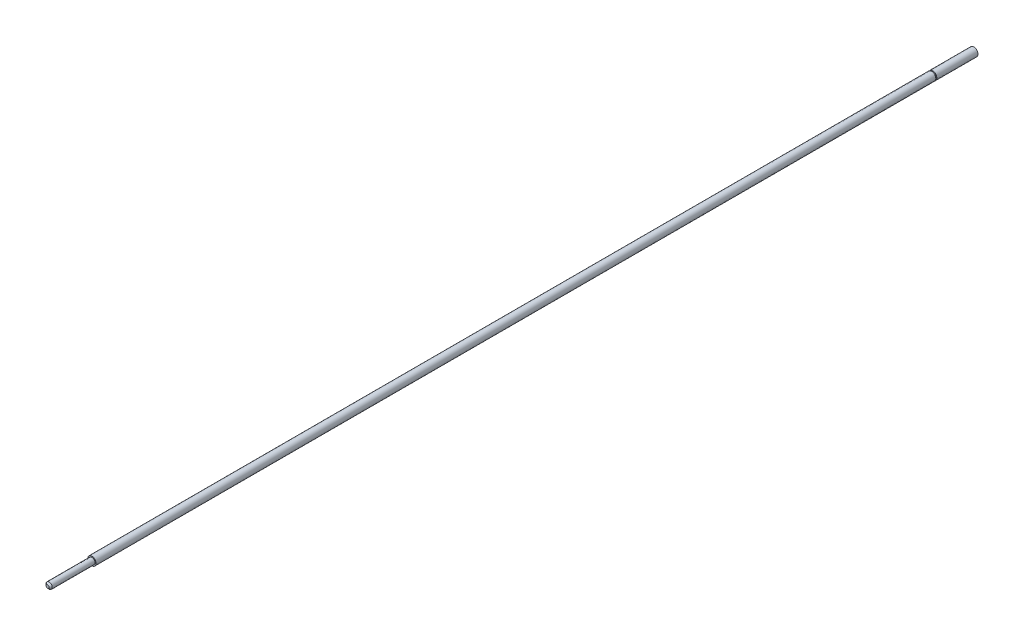
ISO-10303-21;
HEADER;
FILE_DESCRIPTION(('STEP AP214'),'2;1');
FILE_NAME('part.step','',(''),(''),'','','');
FILE_SCHEMA(('AUTOMOTIVE_DESIGN { 1 0 10303 214 1 1 1 1 }'));
ENDSEC;
DATA;
#1=APPLICATION_CONTEXT('core data for automotive mechanical design processes');
#2=APPLICATION_PROTOCOL_DEFINITION('international standard','automotive_design',2000,#1);
#3=PRODUCT_CONTEXT('',#1,'mechanical');
#4=PRODUCT('Part','Part','',(#3));
#5=PRODUCT_RELATED_PRODUCT_CATEGORY('part','',(#4));
#6=PRODUCT_DEFINITION_FORMATION('','',#4);
#7=PRODUCT_DEFINITION_CONTEXT('part definition',#1,'design');
#8=PRODUCT_DEFINITION('design','',#6,#7);
#9=PRODUCT_DEFINITION_SHAPE('','',#8);
#10=(LENGTH_UNIT() NAMED_UNIT(*) SI_UNIT(.MILLI.,.METRE.));
#11=(NAMED_UNIT(*) PLANE_ANGLE_UNIT() SI_UNIT($,.RADIAN.));
#12=(NAMED_UNIT(*) SI_UNIT($,.STERADIAN.) SOLID_ANGLE_UNIT());
#13=UNCERTAINTY_MEASURE_WITH_UNIT(LENGTH_MEASURE(1.E-05),#10,'distance_accuracy_value','');
#14=(GEOMETRIC_REPRESENTATION_CONTEXT(3) GLOBAL_UNCERTAINTY_ASSIGNED_CONTEXT((#13)) GLOBAL_UNIT_ASSIGNED_CONTEXT((#10,
#11,#12)) REPRESENTATION_CONTEXT('',''));
#15=CARTESIAN_POINT('',(0.,0.,0.));
#16=DIRECTION('',(0.,0.,1.));
#17=DIRECTION('',(1.,0.,0.));
#18=AXIS2_PLACEMENT_3D('',#15,#16,#17);
#19=CARTESIAN_POINT('',(0.,0.,846.));
#20=DIRECTION('',(0.,0.,1.));
#21=DIRECTION('',(1.,0.,0.));
#22=AXIS2_PLACEMENT_3D('',#19,#20,#21);
#23=PLANE('',#22);
#24=CARTESIAN_POINT('',(0.,0.,846.));
#25=DIRECTION('',(0.,0.,1.));
#26=DIRECTION('',(1.,0.,0.));
#27=AXIS2_PLACEMENT_3D('',#24,#25,#26);
#28=CIRCLE('',#27,4.);
#29=CARTESIAN_POINT('',(4.,0.,846.));
#30=VERTEX_POINT('',#29);
#31=EDGE_CURVE('E143',#30,#30,#28,.T.);
#32=ORIENTED_EDGE('',*,*,#31,.T.);
#33=EDGE_LOOP('',(#32));
#34=FACE_BOUND('',#33,.T.);
#35=CARTESIAN_POINT('',(0.,0.,846.));
#36=DIRECTION('',(0.,0.,1.));
#37=DIRECTION('',(1.,0.,0.));
#38=AXIS2_PLACEMENT_3D('',#35,#36,#37);
#39=CIRCLE('',#38,3.);
#40=CARTESIAN_POINT('',(3.,0.,846.));
#41=VERTEX_POINT('',#40);
#42=EDGE_CURVE('E134',#41,#41,#39,.T.);
#43=ORIENTED_EDGE('',*,*,#42,.F.);
#44=EDGE_LOOP('',(#43));
#45=FACE_BOUND('',#44,.T.);
#46=ADVANCED_FACE('F32',(#34,#45),#23,.T.);
#47=CARTESIAN_POINT('',(0.,0.,39.5));
#48=DIRECTION('',(0.,0.,1.));
#49=DIRECTION('',(1.,0.,0.));
#50=AXIS2_PLACEMENT_3D('',#47,#48,#49);
#51=PLANE('',#50);
#52=CARTESIAN_POINT('',(0.,0.,39.5));
#53=DIRECTION('',(0.,0.,1.));
#54=DIRECTION('',(1.,0.,0.));
#55=AXIS2_PLACEMENT_3D('',#52,#53,#54);
#56=CIRCLE('',#55,4.);
#57=CARTESIAN_POINT('',(4.,0.,39.5));
#58=VERTEX_POINT('',#57);
#59=EDGE_CURVE('E155',#58,#58,#56,.T.);
#60=ORIENTED_EDGE('',*,*,#59,.T.);
#61=EDGE_LOOP('',(#60));
#62=FACE_BOUND('',#61,.T.);
#63=CARTESIAN_POINT('',(0.,0.,39.5));
#64=DIRECTION('',(0.,0.,1.));
#65=DIRECTION('',(1.,0.,0.));
#66=AXIS2_PLACEMENT_3D('',#63,#64,#65);
#67=CIRCLE('',#66,3.);
#68=CARTESIAN_POINT('',(3.,0.,39.5));
#69=VERTEX_POINT('',#68);
#70=EDGE_CURVE('E146',#69,#69,#67,.T.);
#71=ORIENTED_EDGE('',*,*,#70,.F.);
#72=EDGE_LOOP('',(#71));
#73=FACE_BOUND('',#72,.T.);
#74=ADVANCED_FACE('F173',(#62,#73),#51,.T.);
#75=CARTESIAN_POINT('',(0.,0.,39.5));
#76=DIRECTION('',(0.,0.,-1.));
#77=DIRECTION('',(-1.,0.,0.));
#78=AXIS2_PLACEMENT_3D('',#75,#76,#77);
#79=CYLINDRICAL_SURFACE('',#78,4.);
#80=ORIENTED_EDGE('',*,*,#59,.F.);
#81=EDGE_LOOP('',(#80));
#82=FACE_BOUND('',#81,.T.);
#83=CARTESIAN_POINT('',(0.,0.,0.));
#84=DIRECTION('',(0.,0.,1.));
#85=DIRECTION('',(1.,0.,0.));
#86=AXIS2_PLACEMENT_3D('',#83,#84,#85);
#87=CIRCLE('',#86,4.);
#88=CARTESIAN_POINT('',(4.,0.,0.));
#89=VERTEX_POINT('',#88);
#90=EDGE_CURVE('E152',#89,#89,#87,.T.);
#91=ORIENTED_EDGE('',*,*,#90,.T.);
#92=EDGE_LOOP('',(#91));
#93=FACE_BOUND('',#92,.T.);
#94=ADVANCED_FACE('F179',(#82,#93),#79,.T.);
#95=CARTESIAN_POINT('',(0.,0.,0.));
#96=DIRECTION('',(0.,0.,1.));
#97=DIRECTION('',(1.,0.,0.));
#98=AXIS2_PLACEMENT_3D('',#95,#96,#97);
#99=PLANE('',#98);
#100=DIRECTION('',(1.,0.,0.));
#101=VECTOR('',#100,1.);
#102=CARTESIAN_POINT('',(1.5,2.59807621135332,0.));
#103=LINE('',#102,#101);
#104=CARTESIAN_POINT('',(-1.5,2.59807621135332,0.));
#105=VERTEX_POINT('',#104);
#106=CARTESIAN_POINT('',(1.5,2.59807621135332,0.));
#107=VERTEX_POINT('',#106);
#108=EDGE_CURVE('E121',#105,#107,#103,.T.);
#109=ORIENTED_EDGE('',*,*,#108,.F.);
#110=DIRECTION('',(0.500000000000001,0.866025403784438,0.));
#111=VECTOR('',#110,1.);
#112=CARTESIAN_POINT('',(-1.5,2.59807621135332,0.));
#113=LINE('',#112,#111);
#114=CARTESIAN_POINT('',(-3.,0.,0.));
#115=VERTEX_POINT('',#114);
#116=EDGE_CURVE('E47',#115,#105,#113,.T.);
#117=ORIENTED_EDGE('',*,*,#116,.F.);
#118=DIRECTION('',(-0.5,0.866025403784439,0.));
#119=VECTOR('',#118,1.);
#120=CARTESIAN_POINT('',(-3.,0.,0.));
#121=LINE('',#120,#119);
#122=CARTESIAN_POINT('',(-1.5,-2.59807621135332,0.));
#123=VERTEX_POINT('',#122);
#124=EDGE_CURVE('E130',#123,#115,#121,.T.);
#125=ORIENTED_EDGE('',*,*,#124,.F.);
#126=DIRECTION('',(-1.,0.,0.));
#127=VECTOR('',#126,1.);
#128=CARTESIAN_POINT('',(-1.5,-2.59807621135332,0.));
#129=LINE('',#128,#127);
#130=CARTESIAN_POINT('',(1.5,-2.59807621135332,0.));
#131=VERTEX_POINT('',#130);
#132=EDGE_CURVE('E128',#131,#123,#129,.T.);
#133=ORIENTED_EDGE('',*,*,#132,.F.);
#134=DIRECTION('',(-0.5,-0.866025403784439,0.));
#135=VECTOR('',#134,1.);
#136=CARTESIAN_POINT('',(1.5,-2.59807621135332,0.));
#137=LINE('',#136,#135);
#138=CARTESIAN_POINT('',(3.,0.,0.));
#139=VERTEX_POINT('',#138);
#140=EDGE_CURVE('E95',#139,#131,#137,.T.);
#141=ORIENTED_EDGE('',*,*,#140,.F.);
#142=DIRECTION('',(0.500000000000001,-0.866025403784438,0.));
#143=VECTOR('',#142,1.);
#144=CARTESIAN_POINT('',(3.,0.,0.));
#145=LINE('',#144,#143);
#146=EDGE_CURVE('E124',#107,#139,#145,.T.);
#147=ORIENTED_EDGE('',*,*,#146,.F.);
#148=EDGE_LOOP('',(#109,#117,#125,#133,#141,#147));
#149=FACE_BOUND('',#148,.T.);
#150=ORIENTED_EDGE('',*,*,#90,.F.);
#151=EDGE_LOOP('',(#150));
#152=FACE_BOUND('',#151,.T.);
#153=ADVANCED_FACE('F197',(#149,#152),#99,.F.);
#154=CARTESIAN_POINT('',(0.,0.,40.5));
#155=DIRECTION('',(0.,0.,-1.));
#156=DIRECTION('',(-1.,0.,0.));
#157=AXIS2_PLACEMENT_3D('',#154,#155,#156);
#158=CYLINDRICAL_SURFACE('',#157,3.);
#159=CARTESIAN_POINT('',(0.,0.,40.5));
#160=DIRECTION('',(0.,0.,1.));
#161=DIRECTION('',(1.,0.,0.));
#162=AXIS2_PLACEMENT_3D('',#159,#160,#161);
#163=CIRCLE('',#162,3.);
#164=CARTESIAN_POINT('',(3.,0.,40.5));
#165=VERTEX_POINT('',#164);
#166=EDGE_CURVE('E149',#165,#165,#163,.T.);
#167=ORIENTED_EDGE('',*,*,#166,.F.);
#168=EDGE_LOOP('',(#167));
#169=FACE_BOUND('',#168,.T.);
#170=ORIENTED_EDGE('',*,*,#70,.T.);
#171=EDGE_LOOP('',(#170));
#172=FACE_BOUND('',#171,.T.);
#173=ADVANCED_FACE('F191',(#169,#172),#158,.T.);
#174=CARTESIAN_POINT('',(0.,0.,40.5));
#175=DIRECTION('',(0.,0.,1.));
#176=DIRECTION('',(1.,0.,0.));
#177=AXIS2_PLACEMENT_3D('',#174,#175,#176);
#178=PLANE('',#177);
#179=CARTESIAN_POINT('',(0.,0.,40.5));
#180=DIRECTION('',(0.,0.,1.));
#181=DIRECTION('',(1.,0.,0.));
#182=AXIS2_PLACEMENT_3D('',#179,#180,#181);
#183=CIRCLE('',#182,4.);
#184=CARTESIAN_POINT('',(4.,0.,40.5));
#185=VERTEX_POINT('',#184);
#186=EDGE_CURVE('E142',#185,#185,#183,.T.);
#187=ORIENTED_EDGE('',*,*,#186,.F.);
#188=EDGE_LOOP('',(#187));
#189=FACE_BOUND('',#188,.T.);
#190=ORIENTED_EDGE('',*,*,#166,.T.);
#191=EDGE_LOOP('',(#190));
#192=FACE_BOUND('',#191,.T.);
#193=ADVANCED_FACE('F187',(#189,#192),#178,.F.);
#194=CARTESIAN_POINT('',(0.,0.,846.));
#195=DIRECTION('',(0.,0.,-1.));
#196=DIRECTION('',(-1.,0.,0.));
#197=AXIS2_PLACEMENT_3D('',#194,#195,#196);
#198=CYLINDRICAL_SURFACE('',#197,4.);
#199=ORIENTED_EDGE('',*,*,#31,.F.);
#200=EDGE_LOOP('',(#199));
#201=FACE_BOUND('',#200,.T.);
#202=ORIENTED_EDGE('',*,*,#186,.T.);
#203=EDGE_LOOP('',(#202));
#204=FACE_BOUND('',#203,.T.);
#205=ADVANCED_FACE('F190',(#201,#204),#198,.T.);
#206=CARTESIAN_POINT('',(0.,0.,888.5));
#207=DIRECTION('',(0.,0.,-1.));
#208=DIRECTION('',(-1.,0.,0.));
#209=AXIS2_PLACEMENT_3D('',#206,#207,#208);
#210=CYLINDRICAL_SURFACE('',#209,3.);
#211=CARTESIAN_POINT('',(0.,0.,887.));
#212=DIRECTION('',(0.,0.,1.));
#213=DIRECTION('',(1.,0.,0.));
#214=AXIS2_PLACEMENT_3D('',#211,#212,#213);
#215=CIRCLE('',#214,3.);
#216=CARTESIAN_POINT('',(3.,0.,887.));
#217=VERTEX_POINT('',#216);
#218=EDGE_CURVE('E11',#217,#217,#215,.F.);
#219=ORIENTED_EDGE('',*,*,#218,.T.);
#220=EDGE_LOOP('',(#219));
#221=FACE_BOUND('',#220,.T.);
#222=ORIENTED_EDGE('',*,*,#42,.T.);
#223=EDGE_LOOP('',(#222));
#224=FACE_BOUND('',#223,.T.);
#225=ADVANCED_FACE('F185',(#221,#224),#210,.T.);
#226=CARTESIAN_POINT('',(0.,0.,888.5));
#227=DIRECTION('',(0.,0.,1.));
#228=DIRECTION('',(1.,0.,0.));
#229=AXIS2_PLACEMENT_3D('',#226,#227,#228);
#230=PLANE('',#229);
#231=CARTESIAN_POINT('',(0.,0.,888.5));
#232=DIRECTION('',(0.,0.,1.));
#233=DIRECTION('',(1.,0.,0.));
#234=AXIS2_PLACEMENT_3D('',#231,#232,#233);
#235=CIRCLE('',#234,1.50000000000017);
#236=CARTESIAN_POINT('',(1.50000000000017,0.,888.5));
#237=VERTEX_POINT('',#236);
#238=EDGE_CURVE('E40',#237,#237,#235,.T.);
#239=ORIENTED_EDGE('',*,*,#238,.T.);
#240=EDGE_LOOP('',(#239));
#241=FACE_BOUND('',#240,.T.);
#242=ADVANCED_FACE('F162',(#241),#230,.T.);
#243=CARTESIAN_POINT('',(-1.5,2.59807621135332,5.));
#244=DIRECTION('',(-0.866025403784438,0.500000000000001,0.));
#245=DIRECTION('',(-0.500000000000001,-0.866025403784438,0.));
#246=AXIS2_PLACEMENT_3D('',#243,#244,#245);
#247=PLANE('',#246);
#248=ORIENTED_EDGE('',*,*,#116,.T.);
#249=DIRECTION('',(0.,0.,-1.));
#250=VECTOR('',#249,1.);
#251=CARTESIAN_POINT('',(-1.5,2.59807621135332,5.));
#252=LINE('',#251,#250);
#253=CARTESIAN_POINT('',(-1.5,2.59807621135332,5.));
#254=VERTEX_POINT('',#253);
#255=EDGE_CURVE('E77',#254,#105,#252,.T.);
#256=ORIENTED_EDGE('',*,*,#255,.F.);
#257=DIRECTION('',(0.500000000000001,0.866025403784438,0.));
#258=VECTOR('',#257,1.);
#259=CARTESIAN_POINT('',(-1.5,2.59807621135332,5.));
#260=LINE('',#259,#258);
#261=CARTESIAN_POINT('',(-3.,0.,5.));
#262=VERTEX_POINT('',#261);
#263=EDGE_CURVE('E132',#262,#254,#260,.T.);
#264=ORIENTED_EDGE('',*,*,#263,.F.);
#265=DIRECTION('',(0.,0.,-1.));
#266=VECTOR('',#265,1.);
#267=CARTESIAN_POINT('',(-3.,0.,5.));
#268=LINE('',#267,#266);
#269=EDGE_CURVE('E55',#262,#115,#268,.T.);
#270=ORIENTED_EDGE('',*,*,#269,.T.);
#271=EDGE_LOOP('',(#248,#256,#264,#270));
#272=FACE_BOUND('',#271,.T.);
#273=ADVANCED_FACE('F245',(#272),#247,.F.);
#274=CARTESIAN_POINT('',(-3.,0.,5.));
#275=DIRECTION('',(-0.866025403784438,-0.5,0.));
#276=DIRECTION('',(0.5,-0.866025403784439,0.));
#277=AXIS2_PLACEMENT_3D('',#274,#275,#276);
#278=PLANE('',#277);
#279=ORIENTED_EDGE('',*,*,#124,.T.);
#280=ORIENTED_EDGE('',*,*,#269,.F.);
#281=DIRECTION('',(-0.5,0.866025403784439,0.));
#282=VECTOR('',#281,1.);
#283=CARTESIAN_POINT('',(-3.,0.,5.));
#284=LINE('',#283,#282);
#285=CARTESIAN_POINT('',(-1.5,-2.59807621135332,5.));
#286=VERTEX_POINT('',#285);
#287=EDGE_CURVE('E107',#286,#262,#284,.T.);
#288=ORIENTED_EDGE('',*,*,#287,.F.);
#289=DIRECTION('',(0.,0.,-1.));
#290=VECTOR('',#289,1.);
#291=CARTESIAN_POINT('',(-1.5,-2.59807621135332,5.));
#292=LINE('',#291,#290);
#293=EDGE_CURVE('E99',#286,#123,#292,.T.);
#294=ORIENTED_EDGE('',*,*,#293,.T.);
#295=EDGE_LOOP('',(#279,#280,#288,#294));
#296=FACE_BOUND('',#295,.T.);
#297=ADVANCED_FACE('F250',(#296),#278,.F.);
#298=CARTESIAN_POINT('',(-1.5,-2.59807621135332,5.));
#299=DIRECTION('',(0.,-1.,0.));
#300=DIRECTION('',(0.,0.,-1.));
#301=AXIS2_PLACEMENT_3D('',#298,#299,#300);
#302=PLANE('',#301);
#303=ORIENTED_EDGE('',*,*,#132,.T.);
#304=ORIENTED_EDGE('',*,*,#293,.F.);
#305=DIRECTION('',(-1.,0.,0.));
#306=VECTOR('',#305,1.);
#307=CARTESIAN_POINT('',(-1.5,-2.59807621135332,5.));
#308=LINE('',#307,#306);
#309=CARTESIAN_POINT('',(1.5,-2.59807621135332,5.));
#310=VERTEX_POINT('',#309);
#311=EDGE_CURVE('E103',#310,#286,#308,.T.);
#312=ORIENTED_EDGE('',*,*,#311,.F.);
#313=DIRECTION('',(0.,0.,-1.));
#314=VECTOR('',#313,1.);
#315=CARTESIAN_POINT('',(1.5,-2.59807621135332,5.));
#316=LINE('',#315,#314);
#317=EDGE_CURVE('E88',#310,#131,#316,.T.);
#318=ORIENTED_EDGE('',*,*,#317,.T.);
#319=EDGE_LOOP('',(#303,#304,#312,#318));
#320=FACE_BOUND('',#319,.T.);
#321=ADVANCED_FACE('F104',(#320),#302,.F.);
#322=CARTESIAN_POINT('',(1.5,-2.59807621135332,5.));
#323=DIRECTION('',(0.866025403784438,-0.5,0.));
#324=DIRECTION('',(0.5,0.866025403784439,0.));
#325=AXIS2_PLACEMENT_3D('',#322,#323,#324);
#326=PLANE('',#325);
#327=ORIENTED_EDGE('',*,*,#140,.T.);
#328=ORIENTED_EDGE('',*,*,#317,.F.);
#329=DIRECTION('',(-0.5,-0.866025403784439,0.));
#330=VECTOR('',#329,1.);
#331=CARTESIAN_POINT('',(1.5,-2.59807621135332,5.));
#332=LINE('',#331,#330);
#333=CARTESIAN_POINT('',(3.,0.,5.));
#334=VERTEX_POINT('',#333);
#335=EDGE_CURVE('E92',#334,#310,#332,.T.);
#336=ORIENTED_EDGE('',*,*,#335,.F.);
#337=DIRECTION('',(0.,0.,-1.));
#338=VECTOR('',#337,1.);
#339=CARTESIAN_POINT('',(3.,0.,5.));
#340=LINE('',#339,#338);
#341=EDGE_CURVE('E100',#334,#139,#340,.T.);
#342=ORIENTED_EDGE('',*,*,#341,.T.);
#343=EDGE_LOOP('',(#327,#328,#336,#342));
#344=FACE_BOUND('',#343,.T.);
#345=ADVANCED_FACE('F90',(#344),#326,.F.);
#346=CARTESIAN_POINT('',(3.,0.,5.));
#347=DIRECTION('',(0.866025403784438,0.500000000000001,0.));
#348=DIRECTION('',(-0.500000000000001,0.866025403784438,0.));
#349=AXIS2_PLACEMENT_3D('',#346,#347,#348);
#350=PLANE('',#349);
#351=ORIENTED_EDGE('',*,*,#146,.T.);
#352=ORIENTED_EDGE('',*,*,#341,.F.);
#353=DIRECTION('',(0.500000000000001,-0.866025403784438,0.));
#354=VECTOR('',#353,1.);
#355=CARTESIAN_POINT('',(3.,0.,5.));
#356=LINE('',#355,#354);
#357=CARTESIAN_POINT('',(1.5,2.59807621135332,5.));
#358=VERTEX_POINT('',#357);
#359=EDGE_CURVE('E113',#358,#334,#356,.T.);
#360=ORIENTED_EDGE('',*,*,#359,.F.);
#361=DIRECTION('',(0.,0.,-1.));
#362=VECTOR('',#361,1.);
#363=CARTESIAN_POINT('',(1.5,2.59807621135332,5.));
#364=LINE('',#363,#362);
#365=EDGE_CURVE('E137',#358,#107,#364,.T.);
#366=ORIENTED_EDGE('',*,*,#365,.T.);
#367=EDGE_LOOP('',(#351,#352,#360,#366));
#368=FACE_BOUND('',#367,.T.);
#369=ADVANCED_FACE('F269',(#368),#350,.F.);
#370=CARTESIAN_POINT('',(1.5,2.59807621135332,5.));
#371=DIRECTION('',(0.,1.,0.));
#372=DIRECTION('',(0.,0.,1.));
#373=AXIS2_PLACEMENT_3D('',#370,#371,#372);
#374=PLANE('',#373);
#375=ORIENTED_EDGE('',*,*,#108,.T.);
#376=ORIENTED_EDGE('',*,*,#365,.F.);
#377=DIRECTION('',(1.,0.,0.));
#378=VECTOR('',#377,1.);
#379=CARTESIAN_POINT('',(1.5,2.59807621135332,5.));
#380=LINE('',#379,#378);
#381=EDGE_CURVE('E115',#254,#358,#380,.T.);
#382=ORIENTED_EDGE('',*,*,#381,.F.);
#383=ORIENTED_EDGE('',*,*,#255,.T.);
#384=EDGE_LOOP('',(#375,#376,#382,#383));
#385=FACE_BOUND('',#384,.T.);
#386=ADVANCED_FACE('F169',(#385),#374,.F.);
#387=CARTESIAN_POINT('',(-3.,0.,5.));
#388=DIRECTION('',(0.,0.,1.));
#389=DIRECTION('',(1.,0.,0.));
#390=AXIS2_PLACEMENT_3D('',#387,#388,#389);
#391=PLANE('',#390);
#392=ORIENTED_EDGE('',*,*,#263,.T.);
#393=ORIENTED_EDGE('',*,*,#381,.T.);
#394=ORIENTED_EDGE('',*,*,#359,.T.);
#395=ORIENTED_EDGE('',*,*,#335,.T.);
#396=ORIENTED_EDGE('',*,*,#311,.T.);
#397=ORIENTED_EDGE('',*,*,#287,.T.);
#398=EDGE_LOOP('',(#392,#393,#394,#395,#396,#397));
#399=FACE_BOUND('',#398,.T.);
#400=ADVANCED_FACE('F110',(#399),#391,.F.);
#401=CARTESIAN_POINT('',(0.,0.,888.5));
#402=DIRECTION('',(0.,0.,-1.));
#403=DIRECTION('',(-1.,0.,0.));
#404=AXIS2_PLACEMENT_3D('',#401,#402,#403);
#405=CONICAL_SURFACE('',#404,1.50000000000017,0.785398163397447);
#406=ORIENTED_EDGE('',*,*,#218,.F.);
#407=EDGE_LOOP('',(#406));
#408=FACE_BOUND('',#407,.T.);
#409=ORIENTED_EDGE('',*,*,#238,.F.);
#410=EDGE_LOOP('',(#409));
#411=FACE_BOUND('',#410,.T.);
#412=ADVANCED_FACE('F34',(#408,#411),#405,.T.);
#413=CLOSED_SHELL('',(#46,#74,#94,#153,#173,#193,#205,#225,#242,#273,#297,#321,#345,#369,#386,
#400,#412));
#414=MANIFOLD_SOLID_BREP('B2',#413);
#415=ADVANCED_BREP_SHAPE_REPRESENTATION('',(#18,#414),#14);
#416=SHAPE_DEFINITION_REPRESENTATION(#9,#415);
ENDSEC;
END-ISO-10303-21;
